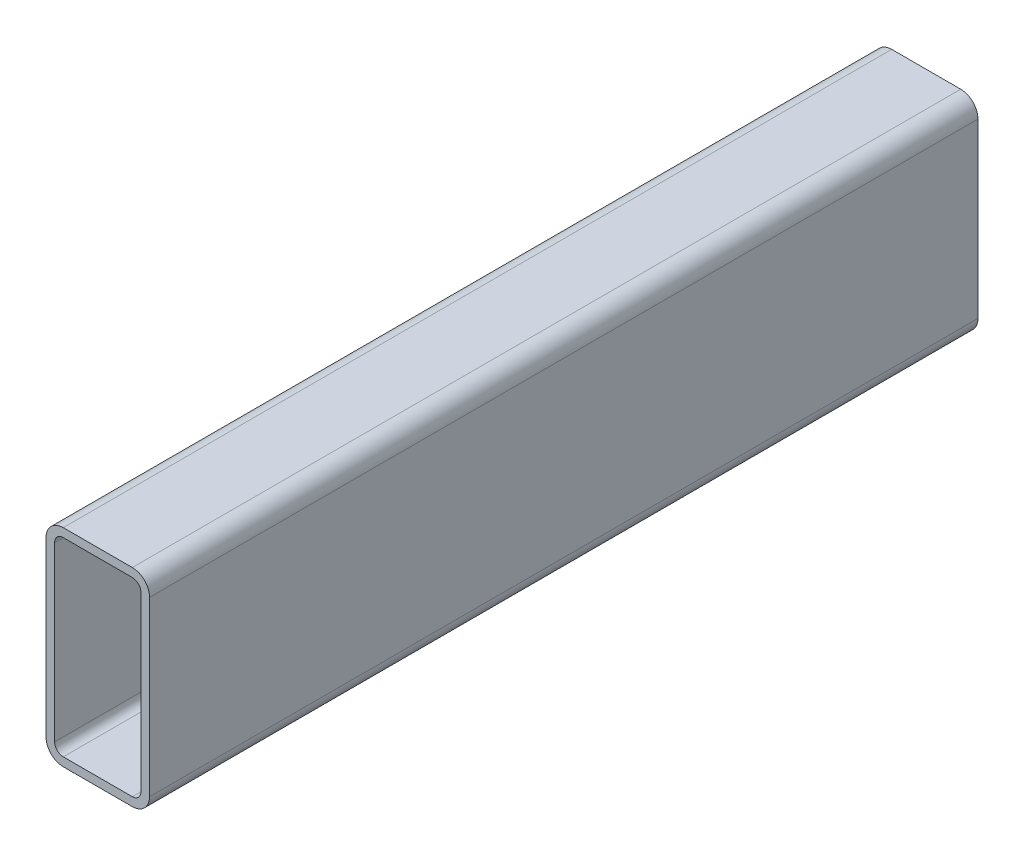
ISO-10303-21;
HEADER;
FILE_DESCRIPTION(('STEP AP214'),'2;1');
FILE_NAME('part.step','',(''),(''),'','','');
FILE_SCHEMA(('AUTOMOTIVE_DESIGN { 1 0 10303 214 1 1 1 1 }'));
ENDSEC;
DATA;
#1=APPLICATION_CONTEXT('core data for automotive mechanical design processes');
#2=APPLICATION_PROTOCOL_DEFINITION('international standard','automotive_design',2000,#1);
#3=PRODUCT_CONTEXT('',#1,'mechanical');
#4=PRODUCT('Part','Part','',(#3));
#5=PRODUCT_RELATED_PRODUCT_CATEGORY('part','',(#4));
#6=PRODUCT_DEFINITION_FORMATION('','',#4);
#7=PRODUCT_DEFINITION_CONTEXT('part definition',#1,'design');
#8=PRODUCT_DEFINITION('design','',#6,#7);
#9=PRODUCT_DEFINITION_SHAPE('','',#8);
#10=(LENGTH_UNIT() NAMED_UNIT(*) SI_UNIT(.MILLI.,.METRE.));
#11=(NAMED_UNIT(*) PLANE_ANGLE_UNIT() SI_UNIT($,.RADIAN.));
#12=(NAMED_UNIT(*) SI_UNIT($,.STERADIAN.) SOLID_ANGLE_UNIT());
#13=UNCERTAINTY_MEASURE_WITH_UNIT(LENGTH_MEASURE(1.E-05),#10,'distance_accuracy_value','');
#14=(GEOMETRIC_REPRESENTATION_CONTEXT(3) GLOBAL_UNCERTAINTY_ASSIGNED_CONTEXT((#13)) GLOBAL_UNIT_ASSIGNED_CONTEXT((#10,
#11,#12)) REPRESENTATION_CONTEXT('',''));
#15=CARTESIAN_POINT('',(0.,0.,0.));
#16=DIRECTION('',(0.,0.,1.));
#17=DIRECTION('',(1.,0.,0.));
#18=AXIS2_PLACEMENT_3D('',#15,#16,#17);
#19=CARTESIAN_POINT('',(-25.4,-63.5,609.6));
#20=DIRECTION('',(0.,0.,1.));
#21=DIRECTION('',(1.,0.,0.));
#22=AXIS2_PLACEMENT_3D('',#19,#20,#21);
#23=PLANE('',#22);
#24=CARTESIAN_POINT('',(-25.4,-63.5,609.6));
#25=DIRECTION('',(0.,0.,1.));
#26=DIRECTION('',(1.,0.,0.));
#27=AXIS2_PLACEMENT_3D('',#24,#25,#26);
#28=CIRCLE('',#27,12.7);
#29=CARTESIAN_POINT('',(-38.1,-63.5,609.6));
#30=VERTEX_POINT('',#29);
#31=CARTESIAN_POINT('',(-25.4,-76.2,609.6));
#32=VERTEX_POINT('',#31);
#33=EDGE_CURVE('E211',#30,#32,#28,.T.);
#34=ORIENTED_EDGE('',*,*,#33,.T.);
#35=DIRECTION('',(1.,0.,0.));
#36=VECTOR('',#35,1.);
#37=CARTESIAN_POINT('',(-25.4,-76.2,609.6));
#38=LINE('',#37,#36);
#39=CARTESIAN_POINT('',(25.4,-76.2,609.6));
#40=VERTEX_POINT('',#39);
#41=EDGE_CURVE('E214',#32,#40,#38,.T.);
#42=ORIENTED_EDGE('',*,*,#41,.T.);
#43=CARTESIAN_POINT('',(25.4,-63.5,609.6));
#44=DIRECTION('',(0.,0.,1.));
#45=DIRECTION('',(1.,0.,0.));
#46=AXIS2_PLACEMENT_3D('',#43,#44,#45);
#47=CIRCLE('',#46,12.7);
#48=CARTESIAN_POINT('',(38.1,-63.5,609.6));
#49=VERTEX_POINT('',#48);
#50=EDGE_CURVE('E217',#40,#49,#47,.T.);
#51=ORIENTED_EDGE('',*,*,#50,.T.);
#52=DIRECTION('',(0.,1.,0.));
#53=VECTOR('',#52,1.);
#54=CARTESIAN_POINT('',(38.1,-63.5,609.6));
#55=LINE('',#54,#53);
#56=CARTESIAN_POINT('',(38.1,63.5,609.6));
#57=VERTEX_POINT('',#56);
#58=EDGE_CURVE('E219',#49,#57,#55,.T.);
#59=ORIENTED_EDGE('',*,*,#58,.T.);
#60=CARTESIAN_POINT('',(25.4,63.5,609.6));
#61=DIRECTION('',(0.,0.,1.));
#62=DIRECTION('',(1.,0.,0.));
#63=AXIS2_PLACEMENT_3D('',#60,#61,#62);
#64=CIRCLE('',#63,12.7);
#65=CARTESIAN_POINT('',(25.4,76.2,609.6));
#66=VERTEX_POINT('',#65);
#67=EDGE_CURVE('E221',#57,#66,#64,.T.);
#68=ORIENTED_EDGE('',*,*,#67,.T.);
#69=DIRECTION('',(-1.,0.,0.));
#70=VECTOR('',#69,1.);
#71=CARTESIAN_POINT('',(-25.4,76.2,609.6));
#72=LINE('',#71,#70);
#73=CARTESIAN_POINT('',(-25.4,76.2,609.6));
#74=VERTEX_POINT('',#73);
#75=EDGE_CURVE('E223',#66,#74,#72,.T.);
#76=ORIENTED_EDGE('',*,*,#75,.T.);
#77=CARTESIAN_POINT('',(-25.4,63.5,609.6));
#78=DIRECTION('',(0.,0.,1.));
#79=DIRECTION('',(-1.,0.,0.));
#80=AXIS2_PLACEMENT_3D('',#77,#78,#79);
#81=CIRCLE('',#80,12.7);
#82=CARTESIAN_POINT('',(-38.1,63.5,609.6));
#83=VERTEX_POINT('',#82);
#84=EDGE_CURVE('E225',#74,#83,#81,.T.);
#85=ORIENTED_EDGE('',*,*,#84,.T.);
#86=DIRECTION('',(0.,-1.,0.));
#87=VECTOR('',#86,1.);
#88=CARTESIAN_POINT('',(-38.1,-63.5,609.6));
#89=LINE('',#88,#87);
#90=EDGE_CURVE('E227',#83,#30,#89,.T.);
#91=ORIENTED_EDGE('',*,*,#90,.T.);
#92=EDGE_LOOP('',(#34,#42,#51,#59,#68,#76,#85,#91));
#93=FACE_BOUND('',#92,.T.);
#94=DIRECTION('',(1.,0.,0.));
#95=VECTOR('',#94,1.);
#96=CARTESIAN_POINT('',(-25.4,-69.85,609.6));
#97=LINE('',#96,#95);
#98=CARTESIAN_POINT('',(-25.4,-69.85,609.6));
#99=VERTEX_POINT('',#98);
#100=CARTESIAN_POINT('',(25.4,-69.85,609.6));
#101=VERTEX_POINT('',#100);
#102=EDGE_CURVE('E154',#99,#101,#97,.T.);
#103=ORIENTED_EDGE('',*,*,#102,.F.);
#104=CARTESIAN_POINT('',(-25.4,-63.5,609.6));
#105=DIRECTION('',(0.,0.,1.));
#106=DIRECTION('',(-1.,0.,0.));
#107=AXIS2_PLACEMENT_3D('',#104,#105,#106);
#108=CIRCLE('',#107,6.35);
#109=CARTESIAN_POINT('',(-31.75,-63.5,609.6));
#110=VERTEX_POINT('',#109);
#111=EDGE_CURVE('E146',#110,#99,#108,.T.);
#112=ORIENTED_EDGE('',*,*,#111,.F.);
#113=DIRECTION('',(0.,-1.,0.));
#114=VECTOR('',#113,1.);
#115=CARTESIAN_POINT('',(-31.75,-63.5,609.6));
#116=LINE('',#115,#114);
#117=CARTESIAN_POINT('',(-31.75,63.5,609.6));
#118=VERTEX_POINT('',#117);
#119=EDGE_CURVE('E179',#118,#110,#116,.T.);
#120=ORIENTED_EDGE('',*,*,#119,.F.);
#121=CARTESIAN_POINT('',(-25.4,63.5,609.6));
#122=DIRECTION('',(0.,0.,1.));
#123=DIRECTION('',(-1.,0.,0.));
#124=AXIS2_PLACEMENT_3D('',#121,#122,#123);
#125=CIRCLE('',#124,6.35);
#126=CARTESIAN_POINT('',(-25.4,69.85,609.6));
#127=VERTEX_POINT('',#126);
#128=EDGE_CURVE('E177',#127,#118,#125,.T.);
#129=ORIENTED_EDGE('',*,*,#128,.F.);
#130=DIRECTION('',(-1.,0.,0.));
#131=VECTOR('',#130,1.);
#132=CARTESIAN_POINT('',(-25.4,69.85,609.6));
#133=LINE('',#132,#131);
#134=CARTESIAN_POINT('',(25.4,69.85,609.6));
#135=VERTEX_POINT('',#134);
#136=EDGE_CURVE('E175',#135,#127,#133,.T.);
#137=ORIENTED_EDGE('',*,*,#136,.F.);
#138=CARTESIAN_POINT('',(25.4,63.5,609.6));
#139=DIRECTION('',(0.,0.,1.));
#140=DIRECTION('',(-1.,0.,0.));
#141=AXIS2_PLACEMENT_3D('',#138,#139,#140);
#142=CIRCLE('',#141,6.35);
#143=CARTESIAN_POINT('',(31.75,63.5,609.6));
#144=VERTEX_POINT('',#143);
#145=EDGE_CURVE('E173',#144,#135,#142,.T.);
#146=ORIENTED_EDGE('',*,*,#145,.F.);
#147=DIRECTION('',(0.,1.,0.));
#148=VECTOR('',#147,1.);
#149=CARTESIAN_POINT('',(31.75,-63.5,609.6));
#150=LINE('',#149,#148);
#151=CARTESIAN_POINT('',(31.75,-63.5,609.6));
#152=VERTEX_POINT('',#151);
#153=EDGE_CURVE('E169',#152,#144,#150,.T.);
#154=ORIENTED_EDGE('',*,*,#153,.F.);
#155=CARTESIAN_POINT('',(25.4,-63.5,609.6));
#156=DIRECTION('',(0.,0.,1.));
#157=DIRECTION('',(1.,0.,0.));
#158=AXIS2_PLACEMENT_3D('',#155,#156,#157);
#159=CIRCLE('',#158,6.35);
#160=EDGE_CURVE('E167',#101,#152,#159,.T.);
#161=ORIENTED_EDGE('',*,*,#160,.F.);
#162=EDGE_LOOP('',(#103,#112,#120,#129,#137,#146,#154,#161));
#163=FACE_BOUND('',#162,.T.);
#164=ADVANCED_FACE('F33',(#93,#163),#23,.T.);
#165=CARTESIAN_POINT('',(-25.4,-63.5,0.));
#166=DIRECTION('',(0.,0.,1.));
#167=DIRECTION('',(1.,0.,0.));
#168=AXIS2_PLACEMENT_3D('',#165,#166,#167);
#169=PLANE('',#168);
#170=CARTESIAN_POINT('',(-25.4,-63.5,0.));
#171=DIRECTION('',(0.,0.,1.));
#172=DIRECTION('',(1.,0.,0.));
#173=AXIS2_PLACEMENT_3D('',#170,#171,#172);
#174=CIRCLE('',#173,12.7);
#175=CARTESIAN_POINT('',(-38.1,-63.5,0.));
#176=VERTEX_POINT('',#175);
#177=CARTESIAN_POINT('',(-25.4,-76.2,0.));
#178=VERTEX_POINT('',#177);
#179=EDGE_CURVE('E162',#176,#178,#174,.T.);
#180=ORIENTED_EDGE('',*,*,#179,.F.);
#181=DIRECTION('',(0.,-1.,0.));
#182=VECTOR('',#181,1.);
#183=CARTESIAN_POINT('',(-38.1,-63.5,0.));
#184=LINE('',#183,#182);
#185=CARTESIAN_POINT('',(-38.1,63.5,0.));
#186=VERTEX_POINT('',#185);
#187=EDGE_CURVE('E215',#186,#176,#184,.T.);
#188=ORIENTED_EDGE('',*,*,#187,.F.);
#189=CARTESIAN_POINT('',(-25.4,63.5,0.));
#190=DIRECTION('',(0.,0.,1.));
#191=DIRECTION('',(-1.,0.,0.));
#192=AXIS2_PLACEMENT_3D('',#189,#190,#191);
#193=CIRCLE('',#192,12.7);
#194=CARTESIAN_POINT('',(-25.4,76.2,0.));
#195=VERTEX_POINT('',#194);
#196=EDGE_CURVE('E242',#195,#186,#193,.T.);
#197=ORIENTED_EDGE('',*,*,#196,.F.);
#198=DIRECTION('',(-1.,0.,0.));
#199=VECTOR('',#198,1.);
#200=CARTESIAN_POINT('',(-25.4,76.2,0.));
#201=LINE('',#200,#199);
#202=CARTESIAN_POINT('',(25.4,76.2,0.));
#203=VERTEX_POINT('',#202);
#204=EDGE_CURVE('E240',#203,#195,#201,.T.);
#205=ORIENTED_EDGE('',*,*,#204,.F.);
#206=CARTESIAN_POINT('',(25.4,63.5,0.));
#207=DIRECTION('',(0.,0.,1.));
#208=DIRECTION('',(1.,0.,0.));
#209=AXIS2_PLACEMENT_3D('',#206,#207,#208);
#210=CIRCLE('',#209,12.7);
#211=CARTESIAN_POINT('',(38.1,63.5,0.));
#212=VERTEX_POINT('',#211);
#213=EDGE_CURVE('E238',#212,#203,#210,.T.);
#214=ORIENTED_EDGE('',*,*,#213,.F.);
#215=DIRECTION('',(0.,1.,0.));
#216=VECTOR('',#215,1.);
#217=CARTESIAN_POINT('',(38.1,-63.5,0.));
#218=LINE('',#217,#216);
#219=CARTESIAN_POINT('',(38.1,-63.5,0.));
#220=VERTEX_POINT('',#219);
#221=EDGE_CURVE('E236',#220,#212,#218,.T.);
#222=ORIENTED_EDGE('',*,*,#221,.F.);
#223=CARTESIAN_POINT('',(25.4,-63.5,0.));
#224=DIRECTION('',(0.,0.,1.));
#225=DIRECTION('',(1.,0.,0.));
#226=AXIS2_PLACEMENT_3D('',#223,#224,#225);
#227=CIRCLE('',#226,12.7);
#228=CARTESIAN_POINT('',(25.4,-76.2,0.));
#229=VERTEX_POINT('',#228);
#230=EDGE_CURVE('E234',#229,#220,#227,.T.);
#231=ORIENTED_EDGE('',*,*,#230,.F.);
#232=DIRECTION('',(1.,0.,0.));
#233=VECTOR('',#232,1.);
#234=CARTESIAN_POINT('',(-25.4,-76.2,0.));
#235=LINE('',#234,#233);
#236=EDGE_CURVE('E232',#178,#229,#235,.T.);
#237=ORIENTED_EDGE('',*,*,#236,.F.);
#238=EDGE_LOOP('',(#180,#188,#197,#205,#214,#222,#231,#237));
#239=FACE_BOUND('',#238,.T.);
#240=CARTESIAN_POINT('',(-25.4,-63.5,0.));
#241=DIRECTION('',(0.,0.,1.));
#242=DIRECTION('',(-1.,0.,0.));
#243=AXIS2_PLACEMENT_3D('',#240,#241,#242);
#244=CIRCLE('',#243,6.35);
#245=CARTESIAN_POINT('',(-31.75,-63.5,0.));
#246=VERTEX_POINT('',#245);
#247=CARTESIAN_POINT('',(-25.4,-69.85,0.));
#248=VERTEX_POINT('',#247);
#249=EDGE_CURVE('E56',#246,#248,#244,.T.);
#250=ORIENTED_EDGE('',*,*,#249,.T.);
#251=DIRECTION('',(1.,0.,0.));
#252=VECTOR('',#251,1.);
#253=CARTESIAN_POINT('',(-25.4,-69.85,0.));
#254=LINE('',#253,#252);
#255=CARTESIAN_POINT('',(25.4,-69.85,0.));
#256=VERTEX_POINT('',#255);
#257=EDGE_CURVE('E161',#248,#256,#254,.T.);
#258=ORIENTED_EDGE('',*,*,#257,.T.);
#259=CARTESIAN_POINT('',(25.4,-63.5,0.));
#260=DIRECTION('',(0.,0.,1.));
#261=DIRECTION('',(1.,0.,0.));
#262=AXIS2_PLACEMENT_3D('',#259,#260,#261);
#263=CIRCLE('',#262,6.35);
#264=CARTESIAN_POINT('',(31.75,-63.5,0.));
#265=VERTEX_POINT('',#264);
#266=EDGE_CURVE('E183',#256,#265,#263,.T.);
#267=ORIENTED_EDGE('',*,*,#266,.T.);
#268=DIRECTION('',(0.,1.,0.));
#269=VECTOR('',#268,1.);
#270=CARTESIAN_POINT('',(31.75,-63.5,0.));
#271=LINE('',#270,#269);
#272=CARTESIAN_POINT('',(31.75,63.5,0.));
#273=VERTEX_POINT('',#272);
#274=EDGE_CURVE('E186',#265,#273,#271,.T.);
#275=ORIENTED_EDGE('',*,*,#274,.T.);
#276=CARTESIAN_POINT('',(25.4,63.5,0.));
#277=DIRECTION('',(0.,0.,1.));
#278=DIRECTION('',(-1.,0.,0.));
#279=AXIS2_PLACEMENT_3D('',#276,#277,#278);
#280=CIRCLE('',#279,6.35);
#281=CARTESIAN_POINT('',(25.4,69.85,0.));
#282=VERTEX_POINT('',#281);
#283=EDGE_CURVE('E189',#273,#282,#280,.T.);
#284=ORIENTED_EDGE('',*,*,#283,.T.);
#285=DIRECTION('',(-1.,0.,0.));
#286=VECTOR('',#285,1.);
#287=CARTESIAN_POINT('',(-25.4,69.85,0.));
#288=LINE('',#287,#286);
#289=CARTESIAN_POINT('',(-25.4,69.85,0.));
#290=VERTEX_POINT('',#289);
#291=EDGE_CURVE('E192',#282,#290,#288,.T.);
#292=ORIENTED_EDGE('',*,*,#291,.T.);
#293=CARTESIAN_POINT('',(-25.4,63.5,0.));
#294=DIRECTION('',(0.,0.,1.));
#295=DIRECTION('',(-1.,0.,0.));
#296=AXIS2_PLACEMENT_3D('',#293,#294,#295);
#297=CIRCLE('',#296,6.35);
#298=CARTESIAN_POINT('',(-31.75,63.5,0.));
#299=VERTEX_POINT('',#298);
#300=EDGE_CURVE('E195',#290,#299,#297,.T.);
#301=ORIENTED_EDGE('',*,*,#300,.T.);
#302=DIRECTION('',(0.,-1.,0.));
#303=VECTOR('',#302,1.);
#304=CARTESIAN_POINT('',(-31.75,-63.5,0.));
#305=LINE('',#304,#303);
#306=EDGE_CURVE('E155',#299,#246,#305,.T.);
#307=ORIENTED_EDGE('',*,*,#306,.T.);
#308=EDGE_LOOP('',(#250,#258,#267,#275,#284,#292,#301,#307));
#309=FACE_BOUND('',#308,.T.);
#310=ADVANCED_FACE('F272',(#239,#309),#169,.F.);
#311=CARTESIAN_POINT('',(-25.4,-63.5,609.6));
#312=DIRECTION('',(0.,0.,-1.));
#313=DIRECTION('',(-1.,0.,0.));
#314=AXIS2_PLACEMENT_3D('',#311,#312,#313);
#315=CYLINDRICAL_SURFACE('',#314,12.7);
#316=ORIENTED_EDGE('',*,*,#179,.T.);
#317=DIRECTION('',(0.,0.,-1.));
#318=VECTOR('',#317,1.);
#319=CARTESIAN_POINT('',(-25.4,-76.2,609.6));
#320=LINE('',#319,#318);
#321=EDGE_CURVE('E11',#32,#178,#320,.T.);
#322=ORIENTED_EDGE('',*,*,#321,.F.);
#323=ORIENTED_EDGE('',*,*,#33,.F.);
#324=DIRECTION('',(0.,0.,-1.));
#325=VECTOR('',#324,1.);
#326=CARTESIAN_POINT('',(-38.1,-63.5,609.6));
#327=LINE('',#326,#325);
#328=EDGE_CURVE('E229',#30,#176,#327,.T.);
#329=ORIENTED_EDGE('',*,*,#328,.T.);
#330=EDGE_LOOP('',(#316,#322,#323,#329));
#331=FACE_BOUND('',#330,.T.);
#332=ADVANCED_FACE('F35',(#331),#315,.T.);
#333=CARTESIAN_POINT('',(-25.4,-76.2,609.6));
#334=DIRECTION('',(0.,1.,0.));
#335=DIRECTION('',(0.,0.,1.));
#336=AXIS2_PLACEMENT_3D('',#333,#334,#335);
#337=PLANE('',#336);
#338=ORIENTED_EDGE('',*,*,#236,.T.);
#339=DIRECTION('',(0.,0.,-1.));
#340=VECTOR('',#339,1.);
#341=CARTESIAN_POINT('',(25.4,-76.2,609.6));
#342=LINE('',#341,#340);
#343=EDGE_CURVE('E41',#40,#229,#342,.T.);
#344=ORIENTED_EDGE('',*,*,#343,.F.);
#345=ORIENTED_EDGE('',*,*,#41,.F.);
#346=ORIENTED_EDGE('',*,*,#321,.T.);
#347=EDGE_LOOP('',(#338,#344,#345,#346));
#348=FACE_BOUND('',#347,.T.);
#349=ADVANCED_FACE('F289',(#348),#337,.F.);
#350=CARTESIAN_POINT('',(25.4,-63.5,609.6));
#351=DIRECTION('',(0.,0.,-1.));
#352=DIRECTION('',(-1.,0.,0.));
#353=AXIS2_PLACEMENT_3D('',#350,#351,#352);
#354=CYLINDRICAL_SURFACE('',#353,12.7);
#355=ORIENTED_EDGE('',*,*,#230,.T.);
#356=DIRECTION('',(0.,0.,-1.));
#357=VECTOR('',#356,1.);
#358=CARTESIAN_POINT('',(38.1,-63.5,609.6));
#359=LINE('',#358,#357);
#360=EDGE_CURVE('E259',#49,#220,#359,.T.);
#361=ORIENTED_EDGE('',*,*,#360,.F.);
#362=ORIENTED_EDGE('',*,*,#50,.F.);
#363=ORIENTED_EDGE('',*,*,#343,.T.);
#364=EDGE_LOOP('',(#355,#361,#362,#363));
#365=FACE_BOUND('',#364,.T.);
#366=ADVANCED_FACE('F266',(#365),#354,.T.);
#367=CARTESIAN_POINT('',(38.1,-63.5,609.6));
#368=DIRECTION('',(-1.,0.,0.));
#369=DIRECTION('',(0.,0.,1.));
#370=AXIS2_PLACEMENT_3D('',#367,#368,#369);
#371=PLANE('',#370);
#372=ORIENTED_EDGE('',*,*,#221,.T.);
#373=DIRECTION('',(0.,0.,-1.));
#374=VECTOR('',#373,1.);
#375=CARTESIAN_POINT('',(38.1,63.5,609.6));
#376=LINE('',#375,#374);
#377=EDGE_CURVE('E256',#57,#212,#376,.T.);
#378=ORIENTED_EDGE('',*,*,#377,.F.);
#379=ORIENTED_EDGE('',*,*,#58,.F.);
#380=ORIENTED_EDGE('',*,*,#360,.T.);
#381=EDGE_LOOP('',(#372,#378,#379,#380));
#382=FACE_BOUND('',#381,.T.);
#383=ADVANCED_FACE('F278',(#382),#371,.F.);
#384=CARTESIAN_POINT('',(25.4,63.5,609.6));
#385=DIRECTION('',(0.,0.,-1.));
#386=DIRECTION('',(-1.,0.,0.));
#387=AXIS2_PLACEMENT_3D('',#384,#385,#386);
#388=CYLINDRICAL_SURFACE('',#387,12.7);
#389=ORIENTED_EDGE('',*,*,#213,.T.);
#390=DIRECTION('',(0.,0.,-1.));
#391=VECTOR('',#390,1.);
#392=CARTESIAN_POINT('',(25.4,76.2,609.6));
#393=LINE('',#392,#391);
#394=EDGE_CURVE('E253',#66,#203,#393,.T.);
#395=ORIENTED_EDGE('',*,*,#394,.F.);
#396=ORIENTED_EDGE('',*,*,#67,.F.);
#397=ORIENTED_EDGE('',*,*,#377,.T.);
#398=EDGE_LOOP('',(#389,#395,#396,#397));
#399=FACE_BOUND('',#398,.T.);
#400=ADVANCED_FACE('F282',(#399),#388,.T.);
#401=CARTESIAN_POINT('',(-25.4,76.2,609.6));
#402=DIRECTION('',(0.,-1.,0.));
#403=DIRECTION('',(0.,0.,-1.));
#404=AXIS2_PLACEMENT_3D('',#401,#402,#403);
#405=PLANE('',#404);
#406=ORIENTED_EDGE('',*,*,#204,.T.);
#407=DIRECTION('',(0.,0.,-1.));
#408=VECTOR('',#407,1.);
#409=CARTESIAN_POINT('',(-25.4,76.2,609.6));
#410=LINE('',#409,#408);
#411=EDGE_CURVE('E250',#74,#195,#410,.T.);
#412=ORIENTED_EDGE('',*,*,#411,.F.);
#413=ORIENTED_EDGE('',*,*,#75,.F.);
#414=ORIENTED_EDGE('',*,*,#394,.T.);
#415=EDGE_LOOP('',(#406,#412,#413,#414));
#416=FACE_BOUND('',#415,.T.);
#417=ADVANCED_FACE('F302',(#416),#405,.F.);
#418=CARTESIAN_POINT('',(-25.4,63.5,609.6));
#419=DIRECTION('',(0.,0.,-1.));
#420=DIRECTION('',(-1.,0.,0.));
#421=AXIS2_PLACEMENT_3D('',#418,#419,#420);
#422=CYLINDRICAL_SURFACE('',#421,12.7);
#423=ORIENTED_EDGE('',*,*,#196,.T.);
#424=DIRECTION('',(0.,0.,-1.));
#425=VECTOR('',#424,1.);
#426=CARTESIAN_POINT('',(-38.1,63.5,609.6));
#427=LINE('',#426,#425);
#428=EDGE_CURVE('E247',#83,#186,#427,.T.);
#429=ORIENTED_EDGE('',*,*,#428,.F.);
#430=ORIENTED_EDGE('',*,*,#84,.F.);
#431=ORIENTED_EDGE('',*,*,#411,.T.);
#432=EDGE_LOOP('',(#423,#429,#430,#431));
#433=FACE_BOUND('',#432,.T.);
#434=ADVANCED_FACE('F300',(#433),#422,.T.);
#435=CARTESIAN_POINT('',(-38.1,-63.5,609.6));
#436=DIRECTION('',(1.,0.,0.));
#437=DIRECTION('',(0.,0.,-1.));
#438=AXIS2_PLACEMENT_3D('',#435,#436,#437);
#439=PLANE('',#438);
#440=ORIENTED_EDGE('',*,*,#187,.T.);
#441=ORIENTED_EDGE('',*,*,#328,.F.);
#442=ORIENTED_EDGE('',*,*,#90,.F.);
#443=ORIENTED_EDGE('',*,*,#428,.T.);
#444=EDGE_LOOP('',(#440,#441,#442,#443));
#445=FACE_BOUND('',#444,.T.);
#446=ADVANCED_FACE('F295',(#445),#439,.F.);
#447=CARTESIAN_POINT('',(-25.4,-63.5,609.6));
#448=DIRECTION('',(0.,0.,-1.));
#449=DIRECTION('',(-1.,0.,0.));
#450=AXIS2_PLACEMENT_3D('',#447,#448,#449);
#451=CYLINDRICAL_SURFACE('',#450,6.35);
#452=ORIENTED_EDGE('',*,*,#249,.F.);
#453=DIRECTION('',(0.,0.,-1.));
#454=VECTOR('',#453,1.);
#455=CARTESIAN_POINT('',(-31.75,-63.5,609.6));
#456=LINE('',#455,#454);
#457=EDGE_CURVE('E150',#110,#246,#456,.T.);
#458=ORIENTED_EDGE('',*,*,#457,.F.);
#459=ORIENTED_EDGE('',*,*,#111,.T.);
#460=DIRECTION('',(0.,0.,-1.));
#461=VECTOR('',#460,1.);
#462=CARTESIAN_POINT('',(-25.4,-69.85,609.6));
#463=LINE('',#462,#461);
#464=EDGE_CURVE('E149',#99,#248,#463,.T.);
#465=ORIENTED_EDGE('',*,*,#464,.T.);
#466=EDGE_LOOP('',(#452,#458,#459,#465));
#467=FACE_BOUND('',#466,.T.);
#468=ADVANCED_FACE('F148',(#467),#451,.F.);
#469=CARTESIAN_POINT('',(-25.4,-69.85,609.6));
#470=DIRECTION('',(0.,1.,0.));
#471=DIRECTION('',(0.,0.,1.));
#472=AXIS2_PLACEMENT_3D('',#469,#470,#471);
#473=PLANE('',#472);
#474=ORIENTED_EDGE('',*,*,#257,.F.);
#475=ORIENTED_EDGE('',*,*,#464,.F.);
#476=ORIENTED_EDGE('',*,*,#102,.T.);
#477=DIRECTION('',(0.,0.,-1.));
#478=VECTOR('',#477,1.);
#479=CARTESIAN_POINT('',(25.4,-69.85,609.6));
#480=LINE('',#479,#478);
#481=EDGE_CURVE('E163',#101,#256,#480,.T.);
#482=ORIENTED_EDGE('',*,*,#481,.T.);
#483=EDGE_LOOP('',(#474,#475,#476,#482));
#484=FACE_BOUND('',#483,.T.);
#485=ADVANCED_FACE('F158',(#484),#473,.T.);
#486=CARTESIAN_POINT('',(25.4,-63.5,609.6));
#487=DIRECTION('',(0.,0.,-1.));
#488=DIRECTION('',(-1.,0.,0.));
#489=AXIS2_PLACEMENT_3D('',#486,#487,#488);
#490=CYLINDRICAL_SURFACE('',#489,6.35);
#491=ORIENTED_EDGE('',*,*,#266,.F.);
#492=ORIENTED_EDGE('',*,*,#481,.F.);
#493=ORIENTED_EDGE('',*,*,#160,.T.);
#494=DIRECTION('',(0.,0.,-1.));
#495=VECTOR('',#494,1.);
#496=CARTESIAN_POINT('',(31.75,-63.5,609.6));
#497=LINE('',#496,#495);
#498=EDGE_CURVE('E208',#152,#265,#497,.T.);
#499=ORIENTED_EDGE('',*,*,#498,.T.);
#500=EDGE_LOOP('',(#491,#492,#493,#499));
#501=FACE_BOUND('',#500,.T.);
#502=ADVANCED_FACE('F327',(#501),#490,.F.);
#503=CARTESIAN_POINT('',(31.75,-63.5,609.6));
#504=DIRECTION('',(-1.,0.,0.));
#505=DIRECTION('',(0.,0.,1.));
#506=AXIS2_PLACEMENT_3D('',#503,#504,#505);
#507=PLANE('',#506);
#508=ORIENTED_EDGE('',*,*,#274,.F.);
#509=ORIENTED_EDGE('',*,*,#498,.F.);
#510=ORIENTED_EDGE('',*,*,#153,.T.);
#511=DIRECTION('',(0.,0.,-1.));
#512=VECTOR('',#511,1.);
#513=CARTESIAN_POINT('',(31.75,63.5,609.6));
#514=LINE('',#513,#512);
#515=EDGE_CURVE('E206',#144,#273,#514,.T.);
#516=ORIENTED_EDGE('',*,*,#515,.T.);
#517=EDGE_LOOP('',(#508,#509,#510,#516));
#518=FACE_BOUND('',#517,.T.);
#519=ADVANCED_FACE('F331',(#518),#507,.T.);
#520=CARTESIAN_POINT('',(25.4,63.5,609.6));
#521=DIRECTION('',(0.,0.,-1.));
#522=DIRECTION('',(-1.,0.,0.));
#523=AXIS2_PLACEMENT_3D('',#520,#521,#522);
#524=CYLINDRICAL_SURFACE('',#523,6.35);
#525=ORIENTED_EDGE('',*,*,#283,.F.);
#526=ORIENTED_EDGE('',*,*,#515,.F.);
#527=ORIENTED_EDGE('',*,*,#145,.T.);
#528=DIRECTION('',(0.,0.,-1.));
#529=VECTOR('',#528,1.);
#530=CARTESIAN_POINT('',(25.4,69.85,609.6));
#531=LINE('',#530,#529);
#532=EDGE_CURVE('E204',#135,#282,#531,.T.);
#533=ORIENTED_EDGE('',*,*,#532,.T.);
#534=EDGE_LOOP('',(#525,#526,#527,#533));
#535=FACE_BOUND('',#534,.T.);
#536=ADVANCED_FACE('F337',(#535),#524,.F.);
#537=CARTESIAN_POINT('',(-25.4,69.85,609.6));
#538=DIRECTION('',(0.,-1.,0.));
#539=DIRECTION('',(0.,0.,-1.));
#540=AXIS2_PLACEMENT_3D('',#537,#538,#539);
#541=PLANE('',#540);
#542=ORIENTED_EDGE('',*,*,#291,.F.);
#543=ORIENTED_EDGE('',*,*,#532,.F.);
#544=ORIENTED_EDGE('',*,*,#136,.T.);
#545=DIRECTION('',(0.,0.,-1.));
#546=VECTOR('',#545,1.);
#547=CARTESIAN_POINT('',(-25.4,69.85,609.6));
#548=LINE('',#547,#546);
#549=EDGE_CURVE('E202',#127,#290,#548,.T.);
#550=ORIENTED_EDGE('',*,*,#549,.T.);
#551=EDGE_LOOP('',(#542,#543,#544,#550));
#552=FACE_BOUND('',#551,.T.);
#553=ADVANCED_FACE('F341',(#552),#541,.T.);
#554=CARTESIAN_POINT('',(-25.4,63.5,609.6));
#555=DIRECTION('',(0.,0.,-1.));
#556=DIRECTION('',(-1.,0.,0.));
#557=AXIS2_PLACEMENT_3D('',#554,#555,#556);
#558=CYLINDRICAL_SURFACE('',#557,6.35);
#559=ORIENTED_EDGE('',*,*,#300,.F.);
#560=ORIENTED_EDGE('',*,*,#549,.F.);
#561=ORIENTED_EDGE('',*,*,#128,.T.);
#562=DIRECTION('',(0.,0.,-1.));
#563=VECTOR('',#562,1.);
#564=CARTESIAN_POINT('',(-31.75,63.5,609.6));
#565=LINE('',#564,#563);
#566=EDGE_CURVE('E48',#118,#299,#565,.T.);
#567=ORIENTED_EDGE('',*,*,#566,.T.);
#568=EDGE_LOOP('',(#559,#560,#561,#567));
#569=FACE_BOUND('',#568,.T.);
#570=ADVANCED_FACE('F345',(#569),#558,.F.);
#571=CARTESIAN_POINT('',(-31.75,-63.5,609.6));
#572=DIRECTION('',(1.,0.,0.));
#573=DIRECTION('',(0.,0.,-1.));
#574=AXIS2_PLACEMENT_3D('',#571,#572,#573);
#575=PLANE('',#574);
#576=ORIENTED_EDGE('',*,*,#306,.F.);
#577=ORIENTED_EDGE('',*,*,#566,.F.);
#578=ORIENTED_EDGE('',*,*,#119,.T.);
#579=ORIENTED_EDGE('',*,*,#457,.T.);
#580=EDGE_LOOP('',(#576,#577,#578,#579));
#581=FACE_BOUND('',#580,.T.);
#582=ADVANCED_FACE('F349',(#581),#575,.T.);
#583=CLOSED_SHELL('',(#164,#310,#332,#349,#366,#383,#400,#417,#434,#446,#468,#485,#502,#519,
#536,#553,#570,#582));
#584=MANIFOLD_SOLID_BREP('B2',#583);
#585=ADVANCED_BREP_SHAPE_REPRESENTATION('',(#18,#584),#14);
#586=SHAPE_DEFINITION_REPRESENTATION(#9,#585);
ENDSEC;
END-ISO-10303-21;
